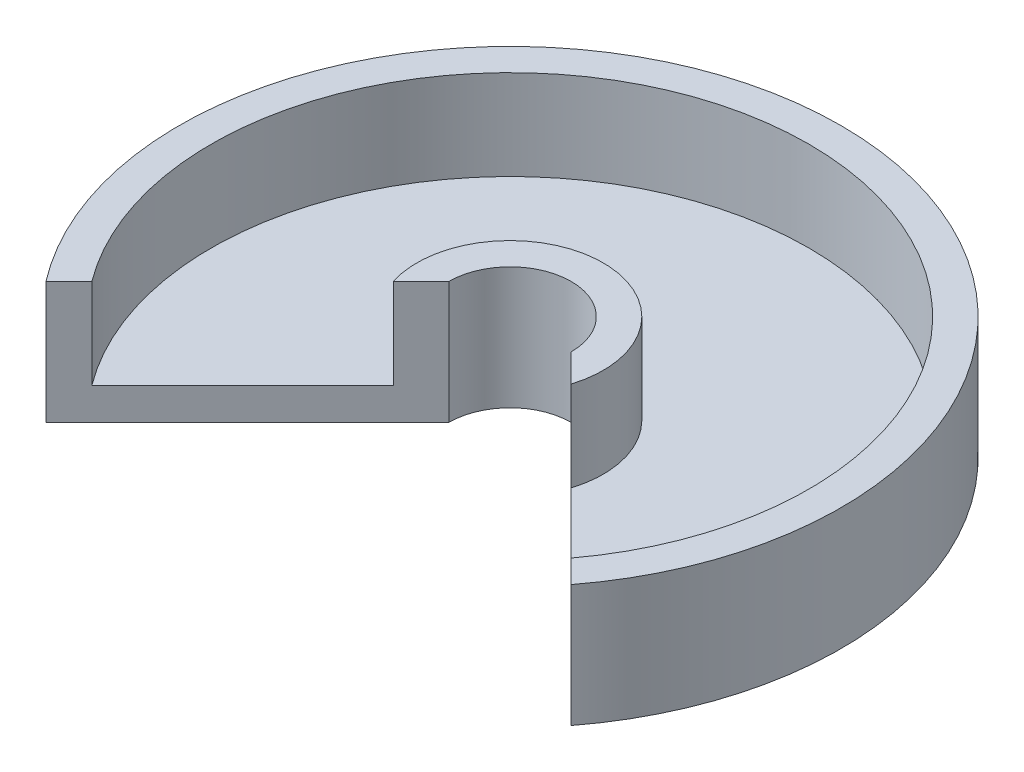
ISO-10303-21;
HEADER;
FILE_DESCRIPTION(('STEP AP214'),'2;1');
FILE_NAME('part.step','',(''),(''),'','','');
FILE_SCHEMA(('AUTOMOTIVE_DESIGN { 1 0 10303 214 1 1 1 1 }'));
ENDSEC;
DATA;
#1=APPLICATION_CONTEXT('core data for automotive mechanical design processes');
#2=APPLICATION_PROTOCOL_DEFINITION('international standard','automotive_design',2000,#1);
#3=PRODUCT_CONTEXT('',#1,'mechanical');
#4=PRODUCT('Part','Part','',(#3));
#5=PRODUCT_RELATED_PRODUCT_CATEGORY('part','',(#4));
#6=PRODUCT_DEFINITION_FORMATION('','',#4);
#7=PRODUCT_DEFINITION_CONTEXT('part definition',#1,'design');
#8=PRODUCT_DEFINITION('design','',#6,#7);
#9=PRODUCT_DEFINITION_SHAPE('','',#8);
#10=(LENGTH_UNIT() NAMED_UNIT(*) SI_UNIT(.MILLI.,.METRE.));
#11=(NAMED_UNIT(*) PLANE_ANGLE_UNIT() SI_UNIT($,.RADIAN.));
#12=(NAMED_UNIT(*) SI_UNIT($,.STERADIAN.) SOLID_ANGLE_UNIT());
#13=UNCERTAINTY_MEASURE_WITH_UNIT(LENGTH_MEASURE(1.E-05),#10,'distance_accuracy_value','');
#14=(GEOMETRIC_REPRESENTATION_CONTEXT(3) GLOBAL_UNCERTAINTY_ASSIGNED_CONTEXT((#13)) GLOBAL_UNIT_ASSIGNED_CONTEXT((#10,
#11,#12)) REPRESENTATION_CONTEXT('',''));
#15=CARTESIAN_POINT('',(0.,0.,0.));
#16=DIRECTION('',(0.,0.,1.));
#17=DIRECTION('',(1.,0.,0.));
#18=AXIS2_PLACEMENT_3D('',#15,#16,#17);
#19=CARTESIAN_POINT('',(-26.3044156077611,-1.5158133340508,0.));
#20=DIRECTION('',(0.,-1.,0.));
#21=DIRECTION('',(0.,0.,-1.));
#22=AXIS2_PLACEMENT_3D('',#19,#20,#21);
#23=PLANE('',#22);
#24=DIRECTION('',(0.707106781186556,0.,0.707106781186539));
#25=VECTOR('',#24,1.);
#26=CARTESIAN_POINT('',(-20.2044156077613,-1.5158133340508,-6.1));
#27=LINE('',#26,#25);
#28=CARTESIAN_POINT('',(-14.1044156077611,-1.5158133340508,0.));
#29=VERTEX_POINT('',#28);
#30=CARTESIAN_POINT('',(-7.83343921948777,-1.5158133340508,6.27097638827318));
#31=VERTEX_POINT('',#30);
#32=EDGE_CURVE('E54',#29,#31,#27,.T.);
#33=ORIENTED_EDGE('',*,*,#32,.F.);
#34=CARTESIAN_POINT('',(-16.0044156077611,-1.5158133340508,0.));
#35=DIRECTION('',(0.,1.,0.));
#36=DIRECTION('',(0.,0.,1.));
#37=AXIS2_PLACEMENT_3D('',#34,#35,#36);
#38=CIRCLE('',#37,1.9);
#39=CARTESIAN_POINT('',(-17.9044156077611,-1.5158133340508,0.));
#40=VERTEX_POINT('',#39);
#41=EDGE_CURVE('E120',#29,#40,#38,.T.);
#42=ORIENTED_EDGE('',*,*,#41,.T.);
#43=DIRECTION('',(0.707106781186541,0.,-0.707106781186554));
#44=VECTOR('',#43,1.);
#45=CARTESIAN_POINT('',(-22.104415607761,-1.5158133340508,4.2));
#46=LINE('',#45,#44);
#47=CARTESIAN_POINT('',(-24.1753919960343,-1.5158133340508,6.27097638827333));
#48=VERTEX_POINT('',#47);
#49=EDGE_CURVE('E100',#48,#40,#46,.T.);
#50=ORIENTED_EDGE('',*,*,#49,.F.);
#51=CARTESIAN_POINT('',(-16.0044156077611,-1.5158133340508,0.));
#52=DIRECTION('',(0.,1.,0.));
#53=DIRECTION('',(0.,0.,1.));
#54=AXIS2_PLACEMENT_3D('',#51,#52,#53);
#55=CIRCLE('',#54,10.3);
#56=EDGE_CURVE('E132',#31,#48,#55,.T.);
#57=ORIENTED_EDGE('',*,*,#56,.F.);
#58=EDGE_LOOP('',(#33,#42,#50,#57));
#59=FACE_BOUND('',#58,.T.);
#60=ADVANCED_FACE('F33',(#59),#23,.T.);
#61=CARTESIAN_POINT('',(-16.0044156077611,9.15034438226435,0.));
#62=DIRECTION('',(0.,1.,0.));
#63=DIRECTION('',(0.,0.,1.));
#64=AXIS2_PLACEMENT_3D('',#61,#62,#63);
#65=CYLINDRICAL_SURFACE('',#64,1.9);
#66=DIRECTION('',(0.,1.,0.));
#67=VECTOR('',#66,1.);
#68=CARTESIAN_POINT('',(-14.1044156077611,-7.7158133340508,0.));
#69=LINE('',#68,#67);
#70=CARTESIAN_POINT('',(-14.1044156077611,2.2841866659492,0.));
#71=VERTEX_POINT('',#70);
#72=EDGE_CURVE('E105',#29,#71,#69,.T.);
#73=ORIENTED_EDGE('',*,*,#72,.T.);
#74=CARTESIAN_POINT('',(-16.0044156077611,2.2841866659492,0.));
#75=DIRECTION('',(0.,1.,0.));
#76=DIRECTION('',(0.,0.,1.));
#77=AXIS2_PLACEMENT_3D('',#74,#75,#76);
#78=CIRCLE('',#77,1.9);
#79=CARTESIAN_POINT('',(-17.9044156077611,2.2841866659492,0.));
#80=VERTEX_POINT('',#79);
#81=EDGE_CURVE('E113',#71,#80,#78,.T.);
#82=ORIENTED_EDGE('',*,*,#81,.T.);
#83=DIRECTION('',(0.,1.,0.));
#84=VECTOR('',#83,1.);
#85=CARTESIAN_POINT('',(-17.9044156077611,-7.7158133340508,0.));
#86=LINE('',#85,#84);
#87=EDGE_CURVE('E94',#40,#80,#86,.T.);
#88=ORIENTED_EDGE('',*,*,#87,.F.);
#89=ORIENTED_EDGE('',*,*,#41,.F.);
#90=EDGE_LOOP('',(#73,#82,#88,#89));
#91=FACE_BOUND('',#90,.T.);
#92=ADVANCED_FACE('F119',(#91),#65,.F.);
#93=CARTESIAN_POINT('',(-18.9044156077611,2.2841866659492,0.));
#94=DIRECTION('',(0.,1.,0.));
#95=DIRECTION('',(0.,0.,1.));
#96=AXIS2_PLACEMENT_3D('',#93,#94,#95);
#97=PLANE('',#96);
#98=DIRECTION('',(-0.707106781186556,0.,-0.707106781186539));
#99=VECTOR('',#98,1.);
#100=CARTESIAN_POINT('',(-14.1044156077611,2.2841866659492,0.));
#101=LINE('',#100,#99);
#102=CARTESIAN_POINT('',(-13.2371374232225,2.2841866659492,0.867278184538609));
#103=VERTEX_POINT('',#102);
#104=EDGE_CURVE('E116',#103,#71,#101,.T.);
#105=ORIENTED_EDGE('',*,*,#104,.F.);
#106=CARTESIAN_POINT('',(-16.0044156077611,2.2841866659492,0.));
#107=DIRECTION('',(0.,1.,0.));
#108=DIRECTION('',(0.,0.,1.));
#109=AXIS2_PLACEMENT_3D('',#106,#107,#108);
#110=CIRCLE('',#109,2.9);
#111=CARTESIAN_POINT('',(-18.7716937922997,2.2841866659492,0.867278184538637));
#112=VERTEX_POINT('',#111);
#113=EDGE_CURVE('E115',#103,#112,#110,.T.);
#114=ORIENTED_EDGE('',*,*,#113,.T.);
#115=DIRECTION('',(-0.707106781186541,0.,0.707106781186554));
#116=VECTOR('',#115,1.);
#117=CARTESIAN_POINT('',(-17.9044156077611,2.2841866659492,0.));
#118=LINE('',#117,#116);
#119=EDGE_CURVE('E97',#80,#112,#118,.T.);
#120=ORIENTED_EDGE('',*,*,#119,.F.);
#121=ORIENTED_EDGE('',*,*,#81,.F.);
#122=EDGE_LOOP('',(#105,#114,#120,#121));
#123=FACE_BOUND('',#122,.T.);
#124=ADVANCED_FACE('F112',(#123),#97,.T.);
#125=CARTESIAN_POINT('',(-16.0044156077611,9.15034438226435,0.));
#126=DIRECTION('',(0.,1.,0.));
#127=DIRECTION('',(0.,0.,1.));
#128=AXIS2_PLACEMENT_3D('',#125,#126,#127);
#129=CYLINDRICAL_SURFACE('',#128,2.9);
#130=DIRECTION('',(0.,1.,0.));
#131=VECTOR('',#130,1.);
#132=CARTESIAN_POINT('',(-13.2371374232225,9.15034438226435,0.867278184538609));
#133=LINE('',#132,#131);
#134=CARTESIAN_POINT('',(-13.2371374232225,-0.515813334050803,0.86727818453861));
#135=VERTEX_POINT('',#134);
#136=EDGE_CURVE('E141',#135,#103,#133,.T.);
#137=ORIENTED_EDGE('',*,*,#136,.F.);
#138=CARTESIAN_POINT('',(-16.0044156077611,-0.515813334050803,0.));
#139=DIRECTION('',(0.,1.,0.));
#140=DIRECTION('',(0.,0.,1.));
#141=AXIS2_PLACEMENT_3D('',#138,#139,#140);
#142=CIRCLE('',#141,2.9);
#143=CARTESIAN_POINT('',(-18.7716937922997,-0.515813334050803,0.867278184538637));
#144=VERTEX_POINT('',#143);
#145=EDGE_CURVE('E123',#135,#144,#142,.T.);
#146=ORIENTED_EDGE('',*,*,#145,.T.);
#147=DIRECTION('',(0.,1.,0.));
#148=VECTOR('',#147,1.);
#149=CARTESIAN_POINT('',(-18.7716937922997,9.15034438226435,0.867278184538636));
#150=LINE('',#149,#148);
#151=EDGE_CURVE('E134',#112,#144,#150,.F.);
#152=ORIENTED_EDGE('',*,*,#151,.F.);
#153=ORIENTED_EDGE('',*,*,#113,.F.);
#154=EDGE_LOOP('',(#137,#146,#152,#153));
#155=FACE_BOUND('',#154,.T.);
#156=ADVANCED_FACE('F153',(#155),#129,.T.);
#157=CARTESIAN_POINT('',(-25.3044156077611,-0.515813334050803,0.));
#158=DIRECTION('',(0.,1.,0.));
#159=DIRECTION('',(0.,0.,1.));
#160=AXIS2_PLACEMENT_3D('',#157,#158,#159);
#161=PLANE('',#160);
#162=DIRECTION('',(-0.707106781186556,0.,-0.707106781186539));
#163=VECTOR('',#162,1.);
#164=CARTESIAN_POINT('',(-19.7044156077612,-0.515813334050803,-5.6));
#165=LINE('',#164,#163);
#166=CARTESIAN_POINT('',(-8.54730411340351,-0.515813334050803,5.55711149435746));
#167=VERTEX_POINT('',#166);
#168=EDGE_CURVE('E158',#167,#135,#165,.T.);
#169=ORIENTED_EDGE('',*,*,#168,.F.);
#170=CARTESIAN_POINT('',(-16.0044156077611,-0.515813334050803,0.));
#171=DIRECTION('',(0.,1.,0.));
#172=DIRECTION('',(0.,0.,1.));
#173=AXIS2_PLACEMENT_3D('',#170,#171,#172);
#174=CIRCLE('',#173,9.3);
#175=CARTESIAN_POINT('',(-23.4615271021186,-0.515813334050803,5.55711149435759));
#176=VERTEX_POINT('',#175);
#177=EDGE_CURVE('E147',#167,#176,#174,.T.);
#178=ORIENTED_EDGE('',*,*,#177,.T.);
#179=DIRECTION('',(-0.707106781186541,0.,0.707106781186554));
#180=VECTOR('',#179,1.);
#181=CARTESIAN_POINT('',(-21.604415607761,-0.515813334050803,3.7));
#182=LINE('',#181,#180);
#183=EDGE_CURVE('E160',#144,#176,#182,.T.);
#184=ORIENTED_EDGE('',*,*,#183,.F.);
#185=ORIENTED_EDGE('',*,*,#145,.F.);
#186=EDGE_LOOP('',(#169,#178,#184,#185));
#187=FACE_BOUND('',#186,.T.);
#188=ADVANCED_FACE('F157',(#187),#161,.T.);
#189=CARTESIAN_POINT('',(-16.0044156077611,9.15034438226435,0.));
#190=DIRECTION('',(0.,1.,0.));
#191=DIRECTION('',(0.,0.,1.));
#192=AXIS2_PLACEMENT_3D('',#189,#190,#191);
#193=CYLINDRICAL_SURFACE('',#192,9.3);
#194=DIRECTION('',(0.,1.,0.));
#195=VECTOR('',#194,1.);
#196=CARTESIAN_POINT('',(-8.54730411340351,9.15034438226435,5.55711149435746));
#197=LINE('',#196,#195);
#198=CARTESIAN_POINT('',(-8.54730411340351,2.2841866659492,5.55711149435746));
#199=VERTEX_POINT('',#198);
#200=EDGE_CURVE('E133',#199,#167,#197,.F.);
#201=ORIENTED_EDGE('',*,*,#200,.F.);
#202=CARTESIAN_POINT('',(-16.0044156077611,2.2841866659492,0.));
#203=DIRECTION('',(0.,1.,0.));
#204=DIRECTION('',(0.,0.,1.));
#205=AXIS2_PLACEMENT_3D('',#202,#203,#204);
#206=CIRCLE('',#205,9.3);
#207=CARTESIAN_POINT('',(-23.4615271021186,2.2841866659492,5.55711149435759));
#208=VERTEX_POINT('',#207);
#209=EDGE_CURVE('E139',#199,#208,#206,.T.);
#210=ORIENTED_EDGE('',*,*,#209,.T.);
#211=DIRECTION('',(0.,1.,0.));
#212=VECTOR('',#211,1.);
#213=CARTESIAN_POINT('',(-23.4615271021186,9.15034438226435,5.55711149435759));
#214=LINE('',#213,#212);
#215=EDGE_CURVE('E162',#176,#208,#214,.T.);
#216=ORIENTED_EDGE('',*,*,#215,.F.);
#217=ORIENTED_EDGE('',*,*,#177,.F.);
#218=EDGE_LOOP('',(#201,#210,#216,#217));
#219=FACE_BOUND('',#218,.T.);
#220=ADVANCED_FACE('F176',(#219),#193,.F.);
#221=CARTESIAN_POINT('',(-26.3044156077611,2.2841866659492,0.));
#222=DIRECTION('',(0.,1.,0.));
#223=DIRECTION('',(0.,0.,1.));
#224=AXIS2_PLACEMENT_3D('',#221,#222,#223);
#225=PLANE('',#224);
#226=CARTESIAN_POINT('',(-7.83343921948777,2.2841866659492,6.27097638827318));
#227=VERTEX_POINT('',#226);
#228=EDGE_CURVE('E106',#227,#199,#101,.T.);
#229=ORIENTED_EDGE('',*,*,#228,.F.);
#230=CARTESIAN_POINT('',(-16.0044156077611,2.2841866659492,0.));
#231=DIRECTION('',(0.,1.,0.));
#232=DIRECTION('',(0.,0.,1.));
#233=AXIS2_PLACEMENT_3D('',#230,#231,#232);
#234=CIRCLE('',#233,10.3);
#235=CARTESIAN_POINT('',(-24.1753919960343,2.2841866659492,6.27097638827332));
#236=VERTEX_POINT('',#235);
#237=EDGE_CURVE('E137',#227,#236,#234,.T.);
#238=ORIENTED_EDGE('',*,*,#237,.T.);
#239=EDGE_CURVE('E47',#208,#236,#118,.T.);
#240=ORIENTED_EDGE('',*,*,#239,.F.);
#241=ORIENTED_EDGE('',*,*,#209,.F.);
#242=EDGE_LOOP('',(#229,#238,#240,#241));
#243=FACE_BOUND('',#242,.T.);
#244=ADVANCED_FACE('F177',(#243),#225,.T.);
#245=CARTESIAN_POINT('',(-16.0044156077611,9.15034438226435,0.));
#246=DIRECTION('',(0.,1.,0.));
#247=DIRECTION('',(0.,0.,1.));
#248=AXIS2_PLACEMENT_3D('',#245,#246,#247);
#249=CYLINDRICAL_SURFACE('',#248,10.3);
#250=DIRECTION('',(0.,1.,0.));
#251=VECTOR('',#250,1.);
#252=CARTESIAN_POINT('',(-7.83343921948777,9.15034438226435,6.27097638827318));
#253=LINE('',#252,#251);
#254=EDGE_CURVE('E11',#31,#227,#253,.T.);
#255=ORIENTED_EDGE('',*,*,#254,.F.);
#256=ORIENTED_EDGE('',*,*,#56,.T.);
#257=DIRECTION('',(0.,1.,0.));
#258=VECTOR('',#257,1.);
#259=CARTESIAN_POINT('',(-24.1753919960343,9.15034438226435,6.27097638827333));
#260=LINE('',#259,#258);
#261=EDGE_CURVE('E40',#236,#48,#260,.F.);
#262=ORIENTED_EDGE('',*,*,#261,.F.);
#263=ORIENTED_EDGE('',*,*,#237,.F.);
#264=EDGE_LOOP('',(#255,#256,#262,#263));
#265=FACE_BOUND('',#264,.T.);
#266=ADVANCED_FACE('F136',(#265),#249,.T.);
#267=CARTESIAN_POINT('',(-17.9044156077611,-7.7158133340508,0.));
#268=DIRECTION('',(-0.707106781186554,0.,-0.707106781186541));
#269=DIRECTION('',(-0.707106781186541,0.,0.707106781186554));
#270=AXIS2_PLACEMENT_3D('',#267,#268,#269);
#271=PLANE('',#270);
#272=ORIENTED_EDGE('',*,*,#49,.T.);
#273=ORIENTED_EDGE('',*,*,#87,.T.);
#274=ORIENTED_EDGE('',*,*,#119,.T.);
#275=ORIENTED_EDGE('',*,*,#151,.T.);
#276=ORIENTED_EDGE('',*,*,#183,.T.);
#277=ORIENTED_EDGE('',*,*,#215,.T.);
#278=ORIENTED_EDGE('',*,*,#239,.T.);
#279=ORIENTED_EDGE('',*,*,#261,.T.);
#280=EDGE_LOOP('',(#272,#273,#274,#275,#276,#277,#278,#279));
#281=FACE_BOUND('',#280,.T.);
#282=ADVANCED_FACE('F96',(#281),#271,.F.);
#283=CARTESIAN_POINT('',(-14.1044156077611,-7.7158133340508,0.));
#284=DIRECTION('',(0.707106781186539,0.,-0.707106781186556));
#285=DIRECTION('',(-0.707106781186556,0.,-0.707106781186539));
#286=AXIS2_PLACEMENT_3D('',#283,#284,#285);
#287=PLANE('',#286);
#288=ORIENTED_EDGE('',*,*,#32,.T.);
#289=ORIENTED_EDGE('',*,*,#254,.T.);
#290=ORIENTED_EDGE('',*,*,#228,.T.);
#291=ORIENTED_EDGE('',*,*,#200,.T.);
#292=ORIENTED_EDGE('',*,*,#168,.T.);
#293=ORIENTED_EDGE('',*,*,#136,.T.);
#294=ORIENTED_EDGE('',*,*,#104,.T.);
#295=ORIENTED_EDGE('',*,*,#72,.F.);
#296=EDGE_LOOP('',(#288,#289,#290,#291,#292,#293,#294,#295));
#297=FACE_BOUND('',#296,.T.);
#298=ADVANCED_FACE('F168',(#297),#287,.F.);
#299=CLOSED_SHELL('',(#60,#92,#124,#156,#188,#220,#244,#266,#282,#298));
#300=MANIFOLD_SOLID_BREP('B2',#299);
#301=ADVANCED_BREP_SHAPE_REPRESENTATION('',(#18,#300),#14);
#302=SHAPE_DEFINITION_REPRESENTATION(#9,#301);
ENDSEC;
END-ISO-10303-21;
